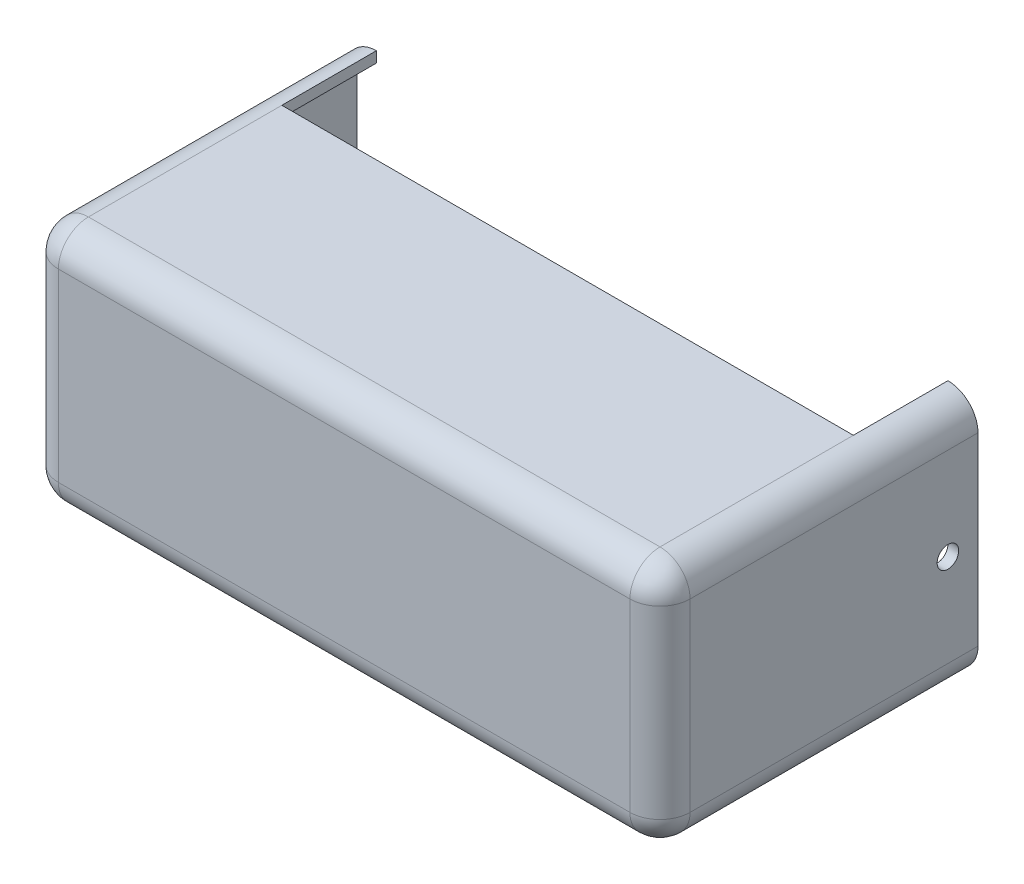
ISO-10303-21;
HEADER;
FILE_DESCRIPTION(('STEP AP214'),'2;1');
FILE_NAME('part.step','',(''),(''),'','','');
FILE_SCHEMA(('AUTOMOTIVE_DESIGN { 1 0 10303 214 1 1 1 1 }'));
ENDSEC;
DATA;
#1=APPLICATION_CONTEXT('core data for automotive mechanical design processes');
#2=APPLICATION_PROTOCOL_DEFINITION('international standard','automotive_design',2000,#1);
#3=PRODUCT_CONTEXT('',#1,'mechanical');
#4=PRODUCT('Part','Part','',(#3));
#5=PRODUCT_RELATED_PRODUCT_CATEGORY('part','',(#4));
#6=PRODUCT_DEFINITION_FORMATION('','',#4);
#7=PRODUCT_DEFINITION_CONTEXT('part definition',#1,'design');
#8=PRODUCT_DEFINITION('design','',#6,#7);
#9=PRODUCT_DEFINITION_SHAPE('','',#8);
#10=(LENGTH_UNIT() NAMED_UNIT(*) SI_UNIT(.MILLI.,.METRE.));
#11=(NAMED_UNIT(*) PLANE_ANGLE_UNIT() SI_UNIT($,.RADIAN.));
#12=(NAMED_UNIT(*) SI_UNIT($,.STERADIAN.) SOLID_ANGLE_UNIT());
#13=UNCERTAINTY_MEASURE_WITH_UNIT(LENGTH_MEASURE(1.E-05),#10,'distance_accuracy_value','');
#14=(GEOMETRIC_REPRESENTATION_CONTEXT(3) GLOBAL_UNCERTAINTY_ASSIGNED_CONTEXT((#13)) GLOBAL_UNIT_ASSIGNED_CONTEXT((#10,
#11,#12)) REPRESENTATION_CONTEXT('',''));
#15=CARTESIAN_POINT('',(0.,0.,0.));
#16=DIRECTION('',(0.,0.,1.));
#17=DIRECTION('',(1.,0.,0.));
#18=AXIS2_PLACEMENT_3D('',#15,#16,#17);
#19=CARTESIAN_POINT('',(373.38,0.,-132.08));
#20=DIRECTION('',(0.,0.,1.));
#21=DIRECTION('',(1.,0.,0.));
#22=AXIS2_PLACEMENT_3D('',#19,#20,#21);
#23=PLANE('',#22);
#24=DIRECTION('',(-1.,0.,0.));
#25=VECTOR('',#24,1.);
#26=CARTESIAN_POINT('',(373.38,138.43,-132.08));
#27=LINE('',#26,#25);
#28=CARTESIAN_POINT('',(355.6,138.43,-132.08));
#29=VERTEX_POINT('',#28);
#30=CARTESIAN_POINT('',(17.7800000000002,138.43,-132.08));
#31=VERTEX_POINT('',#30);
#32=EDGE_CURVE('E352',#29,#31,#27,.T.);
#33=ORIENTED_EDGE('',*,*,#32,.T.);
#34=DIRECTION('',(0.,1.,0.));
#35=VECTOR('',#34,1.);
#36=CARTESIAN_POINT('',(17.7800000000001,0.,-132.08));
#37=LINE('',#36,#35);
#38=CARTESIAN_POINT('',(17.7800000000002,144.78,-132.08));
#39=VERTEX_POINT('',#38);
#40=EDGE_CURVE('E215',#31,#39,#37,.T.);
#41=ORIENTED_EDGE('',*,*,#40,.T.);
#42=DIRECTION('',(-1.,0.,0.));
#43=VECTOR('',#42,1.);
#44=CARTESIAN_POINT('',(373.38,144.78,-132.08));
#45=LINE('',#44,#43);
#46=CARTESIAN_POINT('',(355.6,144.78,-132.08));
#47=VERTEX_POINT('',#46);
#48=EDGE_CURVE('E431',#47,#39,#45,.T.);
#49=ORIENTED_EDGE('',*,*,#48,.F.);
#50=DIRECTION('',(0.,-1.,0.));
#51=VECTOR('',#50,1.);
#52=CARTESIAN_POINT('',(355.6,0.,-132.08));
#53=LINE('',#52,#51);
#54=EDGE_CURVE('E219',#47,#29,#53,.T.);
#55=ORIENTED_EDGE('',*,*,#54,.T.);
#56=EDGE_LOOP('',(#33,#41,#49,#55));
#57=FACE_BOUND('',#56,.T.);
#58=ADVANCED_FACE('F44',(#57),#23,.F.);
#59=CARTESIAN_POINT('',(373.38,0.,0.));
#60=DIRECTION('',(0.,0.,-1.));
#61=DIRECTION('',(-1.,0.,0.));
#62=AXIS2_PLACEMENT_3D('',#59,#60,#61);
#63=PLANE('',#62);
#64=DIRECTION('',(-1.,0.,0.));
#65=VECTOR('',#64,1.);
#66=CARTESIAN_POINT('',(373.38,17.78,0.));
#67=LINE('',#66,#65);
#68=CARTESIAN_POINT('',(17.78,17.78,0.));
#69=VERTEX_POINT('',#68);
#70=CARTESIAN_POINT('',(355.6,17.78,0.));
#71=VERTEX_POINT('',#70);
#72=EDGE_CURVE('E54',#69,#71,#67,.F.);
#73=ORIENTED_EDGE('',*,*,#72,.T.);
#74=DIRECTION('',(0.,-1.,0.));
#75=VECTOR('',#74,1.);
#76=CARTESIAN_POINT('',(355.6,0.,0.));
#77=LINE('',#76,#75);
#78=CARTESIAN_POINT('',(355.6,127.,0.));
#79=VERTEX_POINT('',#78);
#80=EDGE_CURVE('E11',#71,#79,#77,.F.);
#81=ORIENTED_EDGE('',*,*,#80,.T.);
#82=DIRECTION('',(-1.,0.,0.));
#83=VECTOR('',#82,1.);
#84=CARTESIAN_POINT('',(373.38,127.,0.));
#85=LINE('',#84,#83);
#86=CARTESIAN_POINT('',(17.78,127.,0.));
#87=VERTEX_POINT('',#86);
#88=EDGE_CURVE('E481',#79,#87,#85,.T.);
#89=ORIENTED_EDGE('',*,*,#88,.T.);
#90=DIRECTION('',(0.,-1.,0.));
#91=VECTOR('',#90,1.);
#92=CARTESIAN_POINT('',(17.78,0.,0.));
#93=LINE('',#92,#91);
#94=EDGE_CURVE('E478',#87,#69,#93,.T.);
#95=ORIENTED_EDGE('',*,*,#94,.T.);
#96=EDGE_LOOP('',(#73,#81,#89,#95));
#97=FACE_BOUND('',#96,.T.);
#98=ADVANCED_FACE('F542',(#97),#63,.F.);
#99=CARTESIAN_POINT('',(373.38,0.,0.));
#100=DIRECTION('',(0.,1.,0.));
#101=DIRECTION('',(0.,0.,1.));
#102=AXIS2_PLACEMENT_3D('',#99,#100,#101);
#103=PLANE('',#102);
#104=DIRECTION('',(-1.,0.,0.));
#105=VECTOR('',#104,1.);
#106=CARTESIAN_POINT('',(373.38,0.,-17.78));
#107=LINE('',#106,#105);
#108=CARTESIAN_POINT('',(355.6,0.,-17.78));
#109=VERTEX_POINT('',#108);
#110=CARTESIAN_POINT('',(17.78,0.,-17.78));
#111=VERTEX_POINT('',#110);
#112=EDGE_CURVE('E440',#109,#111,#107,.T.);
#113=ORIENTED_EDGE('',*,*,#112,.T.);
#114=DIRECTION('',(0.,0.,-1.));
#115=VECTOR('',#114,1.);
#116=CARTESIAN_POINT('',(17.78,0.,-132.08));
#117=LINE('',#116,#115);
#118=CARTESIAN_POINT('',(17.7800000000001,0.,-132.08));
#119=VERTEX_POINT('',#118);
#120=EDGE_CURVE('E446',#111,#119,#117,.T.);
#121=ORIENTED_EDGE('',*,*,#120,.T.);
#122=DIRECTION('',(-1.,0.,0.));
#123=VECTOR('',#122,1.);
#124=CARTESIAN_POINT('',(373.38,0.,-132.08));
#125=LINE('',#124,#123);
#126=CARTESIAN_POINT('',(355.6,0.,-132.08));
#127=VERTEX_POINT('',#126);
#128=EDGE_CURVE('E435',#127,#119,#125,.T.);
#129=ORIENTED_EDGE('',*,*,#128,.F.);
#130=DIRECTION('',(0.,0.,-1.));
#131=VECTOR('',#130,1.);
#132=CARTESIAN_POINT('',(355.6,0.,0.));
#133=LINE('',#132,#131);
#134=EDGE_CURVE('E443',#127,#109,#133,.F.);
#135=ORIENTED_EDGE('',*,*,#134,.T.);
#136=EDGE_LOOP('',(#113,#121,#129,#135));
#137=FACE_BOUND('',#136,.T.);
#138=ADVANCED_FACE('F560',(#137),#103,.F.);
#139=DIRECTION('',(0.,-1.,0.));
#140=VECTOR('',#139,1.);
#141=CARTESIAN_POINT('',(17.7800000000001,1.16573417585642E-13,-132.08));
#142=LINE('',#141,#140);
#143=CARTESIAN_POINT('',(17.7800000000001,6.35,-132.08));
#144=VERTEX_POINT('',#143);
#145=EDGE_CURVE('E240',#144,#119,#142,.T.);
#146=ORIENTED_EDGE('',*,*,#145,.F.);
#147=DIRECTION('',(-1.,0.,0.));
#148=VECTOR('',#147,1.);
#149=CARTESIAN_POINT('',(373.38,6.35,-132.08));
#150=LINE('',#149,#148);
#151=CARTESIAN_POINT('',(355.6,6.35,-132.08));
#152=VERTEX_POINT('',#151);
#153=EDGE_CURVE('E413',#152,#144,#150,.T.);
#154=ORIENTED_EDGE('',*,*,#153,.F.);
#155=DIRECTION('',(0.,-1.,0.));
#156=VECTOR('',#155,1.);
#157=CARTESIAN_POINT('',(355.6,0.,-132.08));
#158=LINE('',#157,#156);
#159=EDGE_CURVE('E282',#152,#127,#158,.T.);
#160=ORIENTED_EDGE('',*,*,#159,.T.);
#161=ORIENTED_EDGE('',*,*,#128,.T.);
#162=EDGE_LOOP('',(#146,#154,#160,#161));
#163=FACE_BOUND('',#162,.T.);
#164=ADVANCED_FACE('F564',(#163),#23,.F.);
#165=CARTESIAN_POINT('',(373.38,144.78,0.));
#166=DIRECTION('',(0.,-1.,0.));
#167=DIRECTION('',(0.,0.,-1.));
#168=AXIS2_PLACEMENT_3D('',#165,#166,#167);
#169=PLANE('',#168);
#170=DIRECTION('',(-1.,0.,0.));
#171=VECTOR('',#170,1.);
#172=CARTESIAN_POINT('',(373.38,144.78,-17.78));
#173=LINE('',#172,#171);
#174=CARTESIAN_POINT('',(17.78,144.78,-17.78));
#175=VERTEX_POINT('',#174);
#176=CARTESIAN_POINT('',(355.6,144.78,-17.78));
#177=VERTEX_POINT('',#176);
#178=EDGE_CURVE('E468',#175,#177,#173,.F.);
#179=ORIENTED_EDGE('',*,*,#178,.T.);
#180=DIRECTION('',(0.,0.,1.));
#181=VECTOR('',#180,1.);
#182=CARTESIAN_POINT('',(355.6,144.78,0.));
#183=LINE('',#182,#181);
#184=EDGE_CURVE('E474',#177,#47,#183,.F.);
#185=ORIENTED_EDGE('',*,*,#184,.T.);
#186=ORIENTED_EDGE('',*,*,#48,.T.);
#187=DIRECTION('',(0.,0.,1.));
#188=VECTOR('',#187,1.);
#189=CARTESIAN_POINT('',(17.78,144.78,0.));
#190=LINE('',#189,#188);
#191=EDGE_CURVE('E471',#39,#175,#190,.T.);
#192=ORIENTED_EDGE('',*,*,#191,.T.);
#193=EDGE_LOOP('',(#179,#185,#186,#192));
#194=FACE_BOUND('',#193,.T.);
#195=ADVANCED_FACE('F645',(#194),#169,.F.);
#196=CARTESIAN_POINT('',(373.38,0.,0.));
#197=DIRECTION('',(-1.,0.,0.));
#198=DIRECTION('',(0.,0.,1.));
#199=AXIS2_PLACEMENT_3D('',#196,#197,#198);
#200=PLANE('',#199);
#201=CARTESIAN_POINT('',(373.38,72.39,-170.18));
#202=DIRECTION('',(1.,0.,0.));
#203=DIRECTION('',(0.,0.,-1.));
#204=AXIS2_PLACEMENT_3D('',#201,#202,#203);
#205=CIRCLE('',#204,6.34999999999999);
#206=CARTESIAN_POINT('',(373.38,72.39,-176.53));
#207=VERTEX_POINT('',#206);
#208=EDGE_CURVE('E1152',#207,#207,#205,.T.);
#209=ORIENTED_EDGE('',*,*,#208,.F.);
#210=EDGE_LOOP('',(#209));
#211=FACE_BOUND('',#210,.T.);
#212=DIRECTION('',(0.,-1.,0.));
#213=VECTOR('',#212,1.);
#214=CARTESIAN_POINT('',(373.38,0.,-17.78));
#215=LINE('',#214,#213);
#216=CARTESIAN_POINT('',(373.38,127.,-17.78));
#217=VERTEX_POINT('',#216);
#218=CARTESIAN_POINT('',(373.38,17.78,-17.78));
#219=VERTEX_POINT('',#218);
#220=EDGE_CURVE('E459',#217,#219,#215,.T.);
#221=ORIENTED_EDGE('',*,*,#220,.T.);
#222=DIRECTION('',(0.,0.,-1.));
#223=VECTOR('',#222,1.);
#224=CARTESIAN_POINT('',(373.38,17.78,0.));
#225=LINE('',#224,#223);
#226=CARTESIAN_POINT('',(373.38,17.78,-187.96));
#227=VERTEX_POINT('',#226);
#228=EDGE_CURVE('E465',#219,#227,#225,.T.);
#229=ORIENTED_EDGE('',*,*,#228,.T.);
#230=DIRECTION('',(0.,-1.,0.));
#231=VECTOR('',#230,1.);
#232=CARTESIAN_POINT('',(373.38,0.,-187.96));
#233=LINE('',#232,#231);
#234=CARTESIAN_POINT('',(373.38,127.,-187.96));
#235=VERTEX_POINT('',#234);
#236=EDGE_CURVE('E286',#235,#227,#233,.T.);
#237=ORIENTED_EDGE('',*,*,#236,.F.);
#238=DIRECTION('',(0.,0.,1.));
#239=VECTOR('',#238,1.);
#240=CARTESIAN_POINT('',(373.38,127.,0.));
#241=LINE('',#240,#239);
#242=EDGE_CURVE('E462',#235,#217,#241,.T.);
#243=ORIENTED_EDGE('',*,*,#242,.T.);
#244=EDGE_LOOP('',(#221,#229,#237,#243));
#245=FACE_BOUND('',#244,.T.);
#246=ADVANCED_FACE('F637',(#211,#245),#200,.F.);
#247=CARTESIAN_POINT('',(0.,0.,0.));
#248=DIRECTION('',(-1.,0.,0.));
#249=DIRECTION('',(0.,0.,1.));
#250=AXIS2_PLACEMENT_3D('',#247,#248,#249);
#251=PLANE('',#250);
#252=CARTESIAN_POINT('',(0.,72.39,-170.18));
#253=DIRECTION('',(-1.,0.,0.));
#254=DIRECTION('',(0.,0.,1.));
#255=AXIS2_PLACEMENT_3D('',#252,#253,#254);
#256=CIRCLE('',#255,6.34999999999999);
#257=CARTESIAN_POINT('',(0.,72.39,-163.83));
#258=VERTEX_POINT('',#257);
#259=EDGE_CURVE('E246',#258,#258,#256,.T.);
#260=ORIENTED_EDGE('',*,*,#259,.F.);
#261=EDGE_LOOP('',(#260));
#262=FACE_BOUND('',#261,.T.);
#263=DIRECTION('',(0.,0.,1.));
#264=VECTOR('',#263,1.);
#265=CARTESIAN_POINT('',(0.,127.,-132.08));
#266=LINE('',#265,#264);
#267=CARTESIAN_POINT('',(0.,127.,-17.78));
#268=VERTEX_POINT('',#267);
#269=CARTESIAN_POINT('',(0.,127.,-187.96));
#270=VERTEX_POINT('',#269);
#271=EDGE_CURVE('E453',#268,#270,#266,.F.);
#272=ORIENTED_EDGE('',*,*,#271,.T.);
#273=DIRECTION('',(0.,1.,0.));
#274=VECTOR('',#273,1.);
#275=CARTESIAN_POINT('',(0.,0.,-187.96));
#276=LINE('',#275,#274);
#277=CARTESIAN_POINT('',(0.,17.78,-187.96));
#278=VERTEX_POINT('',#277);
#279=EDGE_CURVE('E261',#278,#270,#276,.T.);
#280=ORIENTED_EDGE('',*,*,#279,.F.);
#281=DIRECTION('',(0.,0.,-1.));
#282=VECTOR('',#281,1.);
#283=CARTESIAN_POINT('',(0.,17.78,0.));
#284=LINE('',#283,#282);
#285=CARTESIAN_POINT('',(0.,17.78,-17.78));
#286=VERTEX_POINT('',#285);
#287=EDGE_CURVE('E456',#278,#286,#284,.F.);
#288=ORIENTED_EDGE('',*,*,#287,.T.);
#289=DIRECTION('',(0.,-1.,0.));
#290=VECTOR('',#289,1.);
#291=CARTESIAN_POINT('',(0.,144.78,-17.78));
#292=LINE('',#291,#290);
#293=EDGE_CURVE('E450',#286,#268,#292,.F.);
#294=ORIENTED_EDGE('',*,*,#293,.T.);
#295=EDGE_LOOP('',(#272,#280,#288,#294));
#296=FACE_BOUND('',#295,.T.);
#297=ADVANCED_FACE('F706',(#262,#296),#251,.T.);
#298=CARTESIAN_POINT('',(355.6,127.,0.));
#299=DIRECTION('',(0.,0.,1.));
#300=DIRECTION('',(1.,0.,0.));
#301=AXIS2_PLACEMENT_3D('',#298,#299,#300);
#302=CYLINDRICAL_SURFACE('',#301,17.78);
#303=CARTESIAN_POINT('',(355.6,127.,-17.78));
#304=DIRECTION('',(0.,0.,1.));
#305=DIRECTION('',(1.,0.,0.));
#306=AXIS2_PLACEMENT_3D('',#303,#304,#305);
#307=CIRCLE('',#306,17.78);
#308=EDGE_CURVE('E436',#217,#177,#307,.T.);
#309=ORIENTED_EDGE('',*,*,#308,.F.);
#310=ORIENTED_EDGE('',*,*,#242,.F.);
#311=CARTESIAN_POINT('',(355.6,127.,-187.96));
#312=DIRECTION('',(0.,0.,-1.));
#313=DIRECTION('',(-1.,0.,0.));
#314=AXIS2_PLACEMENT_3D('',#311,#312,#313);
#315=CIRCLE('',#314,17.78);
#316=CARTESIAN_POINT('',(355.6,144.78,-187.96));
#317=VERTEX_POINT('',#316);
#318=EDGE_CURVE('E281',#317,#235,#315,.T.);
#319=ORIENTED_EDGE('',*,*,#318,.F.);
#320=DIRECTION('',(0.,0.,1.));
#321=VECTOR('',#320,1.);
#322=CARTESIAN_POINT('',(355.6,144.78,-187.96));
#323=LINE('',#322,#321);
#324=EDGE_CURVE('E323',#317,#47,#323,.T.);
#325=ORIENTED_EDGE('',*,*,#324,.T.);
#326=ORIENTED_EDGE('',*,*,#184,.F.);
#327=EDGE_LOOP('',(#309,#310,#319,#325,#326));
#328=FACE_BOUND('',#327,.T.);
#329=ADVANCED_FACE('F46',(#328),#302,.T.);
#330=CARTESIAN_POINT('',(355.6,127.,-17.78));
#331=DIRECTION('',(0.,1.,0.));
#332=DIRECTION('',(0.,0.,1.));
#333=AXIS2_PLACEMENT_3D('',#330,#331,#332);
#334=SPHERICAL_SURFACE('',#333,17.78);
#335=CARTESIAN_POINT('',(355.6,127.,-17.78));
#336=DIRECTION('',(0.,1.,0.));
#337=DIRECTION('',(-1.,0.,0.));
#338=AXIS2_PLACEMENT_3D('',#335,#336,#337);
#339=CIRCLE('',#338,17.78);
#340=EDGE_CURVE('E518',#217,#79,#339,.F.);
#341=ORIENTED_EDGE('',*,*,#340,.F.);
#342=ORIENTED_EDGE('',*,*,#308,.T.);
#343=CARTESIAN_POINT('',(355.6,127.,-17.78));
#344=DIRECTION('',(1.,0.,0.));
#345=DIRECTION('',(0.,0.,-1.));
#346=AXIS2_PLACEMENT_3D('',#343,#344,#345);
#347=CIRCLE('',#346,17.78);
#348=EDGE_CURVE('E521',#79,#177,#347,.F.);
#349=ORIENTED_EDGE('',*,*,#348,.F.);
#350=EDGE_LOOP('',(#341,#342,#349));
#351=FACE_BOUND('',#350,.T.);
#352=ADVANCED_FACE('F531',(#351),#334,.T.);
#353=CARTESIAN_POINT('',(17.78,127.,0.));
#354=DIRECTION('',(0.,0.,-1.));
#355=DIRECTION('',(-1.,0.,0.));
#356=AXIS2_PLACEMENT_3D('',#353,#354,#355);
#357=CYLINDRICAL_SURFACE('',#356,17.78);
#358=ORIENTED_EDGE('',*,*,#191,.F.);
#359=DIRECTION('',(0.,0.,1.));
#360=VECTOR('',#359,1.);
#361=CARTESIAN_POINT('',(17.7800000000002,144.78,-187.96));
#362=LINE('',#361,#360);
#363=CARTESIAN_POINT('',(17.7800000000002,144.78,-187.96));
#364=VERTEX_POINT('',#363);
#365=EDGE_CURVE('E266',#364,#39,#362,.T.);
#366=ORIENTED_EDGE('',*,*,#365,.F.);
#367=CARTESIAN_POINT('',(17.78,127.,-187.96));
#368=DIRECTION('',(0.,0.,-1.));
#369=DIRECTION('',(-1.,0.,0.));
#370=AXIS2_PLACEMENT_3D('',#367,#368,#369);
#371=CIRCLE('',#370,17.78);
#372=EDGE_CURVE('E237',#270,#364,#371,.T.);
#373=ORIENTED_EDGE('',*,*,#372,.F.);
#374=ORIENTED_EDGE('',*,*,#271,.F.);
#375=CARTESIAN_POINT('',(17.78,127.,-17.78));
#376=DIRECTION('',(0.,0.,1.));
#377=DIRECTION('',(1.,0.,0.));
#378=AXIS2_PLACEMENT_3D('',#375,#376,#377);
#379=CIRCLE('',#378,17.78);
#380=EDGE_CURVE('E514',#175,#268,#379,.T.);
#381=ORIENTED_EDGE('',*,*,#380,.F.);
#382=EDGE_LOOP('',(#358,#366,#373,#374,#381));
#383=FACE_BOUND('',#382,.T.);
#384=ADVANCED_FACE('F699',(#383),#357,.T.);
#385=CARTESIAN_POINT('',(373.38,127.,-17.78));
#386=DIRECTION('',(-1.,0.,0.));
#387=DIRECTION('',(0.,0.,1.));
#388=AXIS2_PLACEMENT_3D('',#385,#386,#387);
#389=CYLINDRICAL_SURFACE('',#388,17.78);
#390=ORIENTED_EDGE('',*,*,#348,.T.);
#391=ORIENTED_EDGE('',*,*,#178,.F.);
#392=CARTESIAN_POINT('',(17.78,127.,-17.78));
#393=DIRECTION('',(-1.,0.,0.));
#394=DIRECTION('',(0.,0.,1.));
#395=AXIS2_PLACEMENT_3D('',#392,#393,#394);
#396=CIRCLE('',#395,17.78);
#397=EDGE_CURVE('E510',#87,#175,#396,.T.);
#398=ORIENTED_EDGE('',*,*,#397,.F.);
#399=ORIENTED_EDGE('',*,*,#88,.F.);
#400=EDGE_LOOP('',(#390,#391,#398,#399));
#401=FACE_BOUND('',#400,.T.);
#402=ADVANCED_FACE('F538',(#401),#389,.T.);
#403=CARTESIAN_POINT('',(355.6,0.,-17.78));
#404=DIRECTION('',(0.,-1.,0.));
#405=DIRECTION('',(0.,0.,-1.));
#406=AXIS2_PLACEMENT_3D('',#403,#404,#405);
#407=CYLINDRICAL_SURFACE('',#406,17.78);
#408=ORIENTED_EDGE('',*,*,#340,.T.);
#409=ORIENTED_EDGE('',*,*,#80,.F.);
#410=CARTESIAN_POINT('',(355.6,17.78,-17.78));
#411=DIRECTION('',(0.,-1.,0.));
#412=DIRECTION('',(0.,0.,-1.));
#413=AXIS2_PLACEMENT_3D('',#410,#411,#412);
#414=CIRCLE('',#413,17.78);
#415=EDGE_CURVE('E507',#219,#71,#414,.T.);
#416=ORIENTED_EDGE('',*,*,#415,.F.);
#417=ORIENTED_EDGE('',*,*,#220,.F.);
#418=EDGE_LOOP('',(#408,#409,#416,#417));
#419=FACE_BOUND('',#418,.T.);
#420=ADVANCED_FACE('F635',(#419),#407,.T.);
#421=CARTESIAN_POINT('',(355.6,17.78,0.));
#422=DIRECTION('',(0.,0.,-1.));
#423=DIRECTION('',(-1.,0.,0.));
#424=AXIS2_PLACEMENT_3D('',#421,#422,#423);
#425=CYLINDRICAL_SURFACE('',#424,17.78);
#426=ORIENTED_EDGE('',*,*,#134,.F.);
#427=DIRECTION('',(0.,0.,1.));
#428=VECTOR('',#427,1.);
#429=CARTESIAN_POINT('',(355.6,0.,-187.96));
#430=LINE('',#429,#428);
#431=CARTESIAN_POINT('',(355.6,0.,-187.96));
#432=VERTEX_POINT('',#431);
#433=EDGE_CURVE('E320',#432,#127,#430,.T.);
#434=ORIENTED_EDGE('',*,*,#433,.F.);
#435=CARTESIAN_POINT('',(355.6,17.78,-187.96));
#436=DIRECTION('',(0.,0.,-1.));
#437=DIRECTION('',(-1.,0.,0.));
#438=AXIS2_PLACEMENT_3D('',#435,#436,#437);
#439=CIRCLE('',#438,17.78);
#440=EDGE_CURVE('E290',#227,#432,#439,.T.);
#441=ORIENTED_EDGE('',*,*,#440,.F.);
#442=ORIENTED_EDGE('',*,*,#228,.F.);
#443=CARTESIAN_POINT('',(355.6,17.78,-17.78));
#444=DIRECTION('',(0.,0.,1.));
#445=DIRECTION('',(1.,0.,0.));
#446=AXIS2_PLACEMENT_3D('',#443,#444,#445);
#447=CIRCLE('',#446,17.78);
#448=EDGE_CURVE('E503',#109,#219,#447,.T.);
#449=ORIENTED_EDGE('',*,*,#448,.F.);
#450=EDGE_LOOP('',(#426,#434,#441,#442,#449));
#451=FACE_BOUND('',#450,.T.);
#452=ADVANCED_FACE('F629',(#451),#425,.T.);
#453=CARTESIAN_POINT('',(17.78,127.,-17.78));
#454=DIRECTION('',(0.,1.,0.));
#455=DIRECTION('',(-1.,0.,0.));
#456=AXIS2_PLACEMENT_3D('',#453,#454,#455);
#457=SPHERICAL_SURFACE('',#456,17.78);
#458=ORIENTED_EDGE('',*,*,#397,.T.);
#459=ORIENTED_EDGE('',*,*,#380,.T.);
#460=CARTESIAN_POINT('',(17.78,127.,-17.78));
#461=DIRECTION('',(0.,1.,0.));
#462=DIRECTION('',(0.,0.,1.));
#463=AXIS2_PLACEMENT_3D('',#460,#461,#462);
#464=CIRCLE('',#463,17.78);
#465=EDGE_CURVE('E499',#87,#268,#464,.F.);
#466=ORIENTED_EDGE('',*,*,#465,.F.);
#467=EDGE_LOOP('',(#458,#459,#466));
#468=FACE_BOUND('',#467,.T.);
#469=ADVANCED_FACE('F689',(#468),#457,.T.);
#470=CARTESIAN_POINT('',(355.6,17.78,-17.78));
#471=DIRECTION('',(1.,0.,0.));
#472=DIRECTION('',(0.,0.,-1.));
#473=AXIS2_PLACEMENT_3D('',#470,#471,#472);
#474=SPHERICAL_SURFACE('',#473,17.78);
#475=ORIENTED_EDGE('',*,*,#448,.T.);
#476=ORIENTED_EDGE('',*,*,#415,.T.);
#477=CARTESIAN_POINT('',(355.6,17.78,-17.78));
#478=DIRECTION('',(1.,0.,0.));
#479=DIRECTION('',(0.,0.,-1.));
#480=AXIS2_PLACEMENT_3D('',#477,#478,#479);
#481=CIRCLE('',#480,17.78);
#482=EDGE_CURVE('E62',#109,#71,#481,.F.);
#483=ORIENTED_EDGE('',*,*,#482,.F.);
#484=EDGE_LOOP('',(#475,#476,#483));
#485=FACE_BOUND('',#484,.T.);
#486=ADVANCED_FACE('F633',(#485),#474,.T.);
#487=CARTESIAN_POINT('',(17.78,0.,-17.78));
#488=DIRECTION('',(0.,1.,0.));
#489=DIRECTION('',(0.,0.,1.));
#490=AXIS2_PLACEMENT_3D('',#487,#488,#489);
#491=CYLINDRICAL_SURFACE('',#490,17.78);
#492=ORIENTED_EDGE('',*,*,#465,.T.);
#493=ORIENTED_EDGE('',*,*,#293,.F.);
#494=CARTESIAN_POINT('',(17.78,17.78,-17.78));
#495=DIRECTION('',(0.,-1.,0.));
#496=DIRECTION('',(0.,0.,-1.));
#497=AXIS2_PLACEMENT_3D('',#494,#495,#496);
#498=CIRCLE('',#497,17.78);
#499=EDGE_CURVE('E493',#69,#286,#498,.T.);
#500=ORIENTED_EDGE('',*,*,#499,.F.);
#501=ORIENTED_EDGE('',*,*,#94,.F.);
#502=EDGE_LOOP('',(#492,#493,#500,#501));
#503=FACE_BOUND('',#502,.T.);
#504=ADVANCED_FACE('F550',(#503),#491,.T.);
#505=CARTESIAN_POINT('',(373.38,17.78,-17.78));
#506=DIRECTION('',(-1.,0.,0.));
#507=DIRECTION('',(0.,0.,1.));
#508=AXIS2_PLACEMENT_3D('',#505,#506,#507);
#509=CYLINDRICAL_SURFACE('',#508,17.78);
#510=ORIENTED_EDGE('',*,*,#482,.T.);
#511=ORIENTED_EDGE('',*,*,#72,.F.);
#512=CARTESIAN_POINT('',(17.78,17.78,-17.78));
#513=DIRECTION('',(-1.,0.,0.));
#514=DIRECTION('',(0.,0.,1.));
#515=AXIS2_PLACEMENT_3D('',#512,#513,#514);
#516=CIRCLE('',#515,17.78);
#517=EDGE_CURVE('E489',#111,#69,#516,.T.);
#518=ORIENTED_EDGE('',*,*,#517,.F.);
#519=ORIENTED_EDGE('',*,*,#112,.F.);
#520=EDGE_LOOP('',(#510,#511,#518,#519));
#521=FACE_BOUND('',#520,.T.);
#522=ADVANCED_FACE('F547',(#521),#509,.T.);
#523=CARTESIAN_POINT('',(17.78,17.78,-17.78));
#524=DIRECTION('',(0.,0.,1.));
#525=DIRECTION('',(1.,0.,0.));
#526=AXIS2_PLACEMENT_3D('',#523,#524,#525);
#527=SPHERICAL_SURFACE('',#526,17.78);
#528=ORIENTED_EDGE('',*,*,#517,.T.);
#529=ORIENTED_EDGE('',*,*,#499,.T.);
#530=CARTESIAN_POINT('',(17.78,17.78,-17.78));
#531=DIRECTION('',(0.,0.,1.));
#532=DIRECTION('',(0.,-1.,0.));
#533=AXIS2_PLACEMENT_3D('',#530,#531,#532);
#534=CIRCLE('',#533,17.78);
#535=EDGE_CURVE('E335',#111,#286,#534,.F.);
#536=ORIENTED_EDGE('',*,*,#535,.F.);
#537=EDGE_LOOP('',(#528,#529,#536));
#538=FACE_BOUND('',#537,.T.);
#539=ADVANCED_FACE('F552',(#538),#527,.T.);
#540=CARTESIAN_POINT('',(17.78,17.78,0.));
#541=DIRECTION('',(0.,0.,1.));
#542=DIRECTION('',(1.,0.,0.));
#543=AXIS2_PLACEMENT_3D('',#540,#541,#542);
#544=CYLINDRICAL_SURFACE('',#543,17.78);
#545=ORIENTED_EDGE('',*,*,#535,.T.);
#546=ORIENTED_EDGE('',*,*,#287,.F.);
#547=CARTESIAN_POINT('',(17.78,17.78,-187.96));
#548=DIRECTION('',(0.,0.,-1.));
#549=DIRECTION('',(-1.,0.,0.));
#550=AXIS2_PLACEMENT_3D('',#547,#548,#549);
#551=CIRCLE('',#550,17.78);
#552=CARTESIAN_POINT('',(17.7800000000001,0.,-187.96));
#553=VERTEX_POINT('',#552);
#554=EDGE_CURVE('E257',#553,#278,#551,.T.);
#555=ORIENTED_EDGE('',*,*,#554,.F.);
#556=DIRECTION('',(0.,0.,1.));
#557=VECTOR('',#556,1.);
#558=CARTESIAN_POINT('',(17.7800000000001,0.,-187.96));
#559=LINE('',#558,#557);
#560=EDGE_CURVE('E271',#553,#119,#559,.T.);
#561=ORIENTED_EDGE('',*,*,#560,.T.);
#562=ORIENTED_EDGE('',*,*,#120,.F.);
#563=EDGE_LOOP('',(#545,#546,#555,#561,#562));
#564=FACE_BOUND('',#563,.T.);
#565=ADVANCED_FACE('F555',(#564),#544,.T.);
#566=CARTESIAN_POINT('',(373.38,0.,-6.35));
#567=DIRECTION('',(0.,0.,-1.));
#568=DIRECTION('',(-1.,0.,0.));
#569=AXIS2_PLACEMENT_3D('',#566,#567,#568);
#570=PLANE('',#569);
#571=DIRECTION('',(-1.,0.,0.));
#572=VECTOR('',#571,1.);
#573=CARTESIAN_POINT('',(373.38,17.78,-6.35));
#574=LINE('',#573,#572);
#575=CARTESIAN_POINT('',(17.78,17.78,-6.35));
#576=VERTEX_POINT('',#575);
#577=CARTESIAN_POINT('',(355.6,17.78,-6.34999999999999));
#578=VERTEX_POINT('',#577);
#579=EDGE_CURVE('E327',#576,#578,#574,.F.);
#580=ORIENTED_EDGE('',*,*,#579,.F.);
#581=DIRECTION('',(0.,1.,0.));
#582=VECTOR('',#581,1.);
#583=CARTESIAN_POINT('',(17.78,0.,-6.35));
#584=LINE('',#583,#582);
#585=CARTESIAN_POINT('',(17.78,127.,-6.35));
#586=VERTEX_POINT('',#585);
#587=EDGE_CURVE('E338',#586,#576,#584,.F.);
#588=ORIENTED_EDGE('',*,*,#587,.F.);
#589=DIRECTION('',(-1.,0.,0.));
#590=VECTOR('',#589,1.);
#591=CARTESIAN_POINT('',(373.38,127.,-6.35));
#592=LINE('',#591,#590);
#593=CARTESIAN_POINT('',(355.6,127.,-6.35));
#594=VERTEX_POINT('',#593);
#595=EDGE_CURVE('E332',#594,#586,#592,.T.);
#596=ORIENTED_EDGE('',*,*,#595,.F.);
#597=DIRECTION('',(0.,1.,0.));
#598=VECTOR('',#597,1.);
#599=CARTESIAN_POINT('',(355.6,0.,-6.35));
#600=LINE('',#599,#598);
#601=EDGE_CURVE('E331',#578,#594,#600,.T.);
#602=ORIENTED_EDGE('',*,*,#601,.F.);
#603=EDGE_LOOP('',(#580,#588,#596,#602));
#604=FACE_BOUND('',#603,.T.);
#605=ADVANCED_FACE('F591',(#604),#570,.T.);
#606=CARTESIAN_POINT('',(373.38,6.35,0.));
#607=DIRECTION('',(0.,1.,0.));
#608=DIRECTION('',(0.,0.,1.));
#609=AXIS2_PLACEMENT_3D('',#606,#607,#608);
#610=PLANE('',#609);
#611=DIRECTION('',(1.,0.,0.));
#612=VECTOR('',#611,1.);
#613=CARTESIAN_POINT('',(373.38,6.35,-17.78));
#614=LINE('',#613,#612);
#615=CARTESIAN_POINT('',(355.6,6.35,-17.78));
#616=VERTEX_POINT('',#615);
#617=CARTESIAN_POINT('',(17.7800000000001,6.35,-17.78));
#618=VERTEX_POINT('',#617);
#619=EDGE_CURVE('E409',#616,#618,#614,.F.);
#620=ORIENTED_EDGE('',*,*,#619,.F.);
#621=DIRECTION('',(0.,0.,1.));
#622=VECTOR('',#621,1.);
#623=CARTESIAN_POINT('',(355.6,6.35,0.));
#624=LINE('',#623,#622);
#625=EDGE_CURVE('E412',#152,#616,#624,.T.);
#626=ORIENTED_EDGE('',*,*,#625,.F.);
#627=ORIENTED_EDGE('',*,*,#153,.T.);
#628=DIRECTION('',(0.,0.,1.));
#629=VECTOR('',#628,1.);
#630=CARTESIAN_POINT('',(17.7800000000001,6.35,0.));
#631=LINE('',#630,#629);
#632=EDGE_CURVE('E393',#618,#144,#631,.F.);
#633=ORIENTED_EDGE('',*,*,#632,.F.);
#634=EDGE_LOOP('',(#620,#626,#627,#633));
#635=FACE_BOUND('',#634,.T.);
#636=ADVANCED_FACE('F574',(#635),#610,.T.);
#637=CARTESIAN_POINT('',(373.38,138.43,0.));
#638=DIRECTION('',(0.,-1.,0.));
#639=DIRECTION('',(0.,0.,-1.));
#640=AXIS2_PLACEMENT_3D('',#637,#638,#639);
#641=PLANE('',#640);
#642=DIRECTION('',(1.,0.,0.));
#643=VECTOR('',#642,1.);
#644=CARTESIAN_POINT('',(373.38,138.43,-17.78));
#645=LINE('',#644,#643);
#646=CARTESIAN_POINT('',(17.7800000000001,138.43,-17.78));
#647=VERTEX_POINT('',#646);
#648=CARTESIAN_POINT('',(355.6,138.43,-17.78));
#649=VERTEX_POINT('',#648);
#650=EDGE_CURVE('E356',#647,#649,#645,.T.);
#651=ORIENTED_EDGE('',*,*,#650,.F.);
#652=DIRECTION('',(0.,0.,-1.));
#653=VECTOR('',#652,1.);
#654=CARTESIAN_POINT('',(17.7800000000002,138.43,0.));
#655=LINE('',#654,#653);
#656=EDGE_CURVE('E359',#31,#647,#655,.F.);
#657=ORIENTED_EDGE('',*,*,#656,.F.);
#658=ORIENTED_EDGE('',*,*,#32,.F.);
#659=DIRECTION('',(0.,0.,-1.));
#660=VECTOR('',#659,1.);
#661=CARTESIAN_POINT('',(355.6,138.43,0.));
#662=LINE('',#661,#660);
#663=EDGE_CURVE('E341',#649,#29,#662,.T.);
#664=ORIENTED_EDGE('',*,*,#663,.F.);
#665=EDGE_LOOP('',(#651,#657,#658,#664));
#666=FACE_BOUND('',#665,.T.);
#667=ADVANCED_FACE('F650',(#666),#641,.T.);
#668=CARTESIAN_POINT('',(367.03,0.,0.));
#669=DIRECTION('',(-1.,0.,0.));
#670=DIRECTION('',(0.,0.,1.));
#671=AXIS2_PLACEMENT_3D('',#668,#669,#670);
#672=PLANE('',#671);
#673=CARTESIAN_POINT('',(367.03,72.39,-170.18));
#674=DIRECTION('',(-1.,0.,0.));
#675=DIRECTION('',(0.,0.,1.));
#676=AXIS2_PLACEMENT_3D('',#673,#674,#675);
#677=CIRCLE('',#676,6.34999999999999);
#678=CARTESIAN_POINT('',(367.03,72.39,-163.83));
#679=VERTEX_POINT('',#678);
#680=EDGE_CURVE('E1145',#679,#679,#677,.T.);
#681=ORIENTED_EDGE('',*,*,#680,.F.);
#682=EDGE_LOOP('',(#681));
#683=FACE_BOUND('',#682,.T.);
#684=DIRECTION('',(0.,1.,0.));
#685=VECTOR('',#684,1.);
#686=CARTESIAN_POINT('',(367.03,0.,-17.78));
#687=LINE('',#686,#685);
#688=CARTESIAN_POINT('',(367.03,127.,-17.78));
#689=VERTEX_POINT('',#688);
#690=CARTESIAN_POINT('',(367.03,17.78,-17.78));
#691=VERTEX_POINT('',#690);
#692=EDGE_CURVE('E369',#689,#691,#687,.F.);
#693=ORIENTED_EDGE('',*,*,#692,.F.);
#694=DIRECTION('',(0.,0.,1.));
#695=VECTOR('',#694,1.);
#696=CARTESIAN_POINT('',(367.03,127.,0.));
#697=LINE('',#696,#695);
#698=CARTESIAN_POINT('',(367.03,127.,-187.96));
#699=VERTEX_POINT('',#698);
#700=EDGE_CURVE('E366',#699,#689,#697,.T.);
#701=ORIENTED_EDGE('',*,*,#700,.F.);
#702=DIRECTION('',(0.,1.,0.));
#703=VECTOR('',#702,1.);
#704=CARTESIAN_POINT('',(367.03,0.,-187.96));
#705=LINE('',#704,#703);
#706=CARTESIAN_POINT('',(367.03,17.78,-187.96));
#707=VERTEX_POINT('',#706);
#708=EDGE_CURVE('E301',#707,#699,#705,.T.);
#709=ORIENTED_EDGE('',*,*,#708,.F.);
#710=DIRECTION('',(0.,0.,1.));
#711=VECTOR('',#710,1.);
#712=CARTESIAN_POINT('',(367.03,17.78,0.));
#713=LINE('',#712,#711);
#714=EDGE_CURVE('E360',#691,#707,#713,.F.);
#715=ORIENTED_EDGE('',*,*,#714,.F.);
#716=EDGE_LOOP('',(#693,#701,#709,#715));
#717=FACE_BOUND('',#716,.T.);
#718=ADVANCED_FACE('F618',(#683,#717),#672,.T.);
#719=CARTESIAN_POINT('',(6.35,0.,0.));
#720=DIRECTION('',(-1.,0.,0.));
#721=DIRECTION('',(0.,0.,1.));
#722=AXIS2_PLACEMENT_3D('',#719,#720,#721);
#723=PLANE('',#722);
#724=CARTESIAN_POINT('',(6.35,72.39,-170.18));
#725=DIRECTION('',(-1.,0.,0.));
#726=DIRECTION('',(0.,0.,1.));
#727=AXIS2_PLACEMENT_3D('',#724,#725,#726);
#728=CIRCLE('',#727,6.34999999999999);
#729=CARTESIAN_POINT('',(6.35,72.39,-163.83));
#730=VERTEX_POINT('',#729);
#731=EDGE_CURVE('E48',#730,#730,#728,.T.);
#732=ORIENTED_EDGE('',*,*,#731,.T.);
#733=EDGE_LOOP('',(#732));
#734=FACE_BOUND('',#733,.T.);
#735=DIRECTION('',(0.,0.,1.));
#736=VECTOR('',#735,1.);
#737=CARTESIAN_POINT('',(6.35,17.78,0.));
#738=LINE('',#737,#736);
#739=CARTESIAN_POINT('',(6.35000000000002,17.78,-187.96));
#740=VERTEX_POINT('',#739);
#741=CARTESIAN_POINT('',(6.35,17.78,-17.78));
#742=VERTEX_POINT('',#741);
#743=EDGE_CURVE('E372',#740,#742,#738,.T.);
#744=ORIENTED_EDGE('',*,*,#743,.F.);
#745=DIRECTION('',(0.,-1.,0.));
#746=VECTOR('',#745,1.);
#747=CARTESIAN_POINT('',(6.35,0.,-187.96));
#748=LINE('',#747,#746);
#749=CARTESIAN_POINT('',(6.35,127.,-187.96));
#750=VERTEX_POINT('',#749);
#751=EDGE_CURVE('E232',#750,#740,#748,.T.);
#752=ORIENTED_EDGE('',*,*,#751,.F.);
#753=DIRECTION('',(0.,0.,1.));
#754=VECTOR('',#753,1.);
#755=CARTESIAN_POINT('',(6.35,127.,0.));
#756=LINE('',#755,#754);
#757=CARTESIAN_POINT('',(6.35,127.,-17.78));
#758=VERTEX_POINT('',#757);
#759=EDGE_CURVE('E227',#758,#750,#756,.F.);
#760=ORIENTED_EDGE('',*,*,#759,.F.);
#761=DIRECTION('',(0.,1.,0.));
#762=VECTOR('',#761,1.);
#763=CARTESIAN_POINT('',(6.35,0.,-17.78));
#764=LINE('',#763,#762);
#765=EDGE_CURVE('E386',#742,#758,#764,.T.);
#766=ORIENTED_EDGE('',*,*,#765,.F.);
#767=EDGE_LOOP('',(#744,#752,#760,#766));
#768=FACE_BOUND('',#767,.T.);
#769=ADVANCED_FACE('F654',(#734,#768),#723,.F.);
#770=CARTESIAN_POINT('',(355.6,127.,0.));
#771=DIRECTION('',(0.,0.,1.));
#772=DIRECTION('',(1.,0.,0.));
#773=AXIS2_PLACEMENT_3D('',#770,#771,#772);
#774=CYLINDRICAL_SURFACE('',#773,11.43);
#775=CARTESIAN_POINT('',(355.6,127.,-17.78));
#776=DIRECTION('',(0.,0.,1.));
#777=DIRECTION('',(1.,0.,0.));
#778=AXIS2_PLACEMENT_3D('',#775,#776,#777);
#779=CIRCLE('',#778,11.43);
#780=EDGE_CURVE('E348',#689,#649,#779,.T.);
#781=ORIENTED_EDGE('',*,*,#780,.T.);
#782=ORIENTED_EDGE('',*,*,#663,.T.);
#783=DIRECTION('',(0.,0.,1.));
#784=VECTOR('',#783,1.);
#785=CARTESIAN_POINT('',(355.6,138.43,-187.96));
#786=LINE('',#785,#784);
#787=CARTESIAN_POINT('',(355.6,138.43,-187.96));
#788=VERTEX_POINT('',#787);
#789=EDGE_CURVE('E308',#788,#29,#786,.T.);
#790=ORIENTED_EDGE('',*,*,#789,.F.);
#791=CARTESIAN_POINT('',(355.6,127.,-187.96));
#792=DIRECTION('',(0.,0.,-1.));
#793=DIRECTION('',(-1.,0.,0.));
#794=AXIS2_PLACEMENT_3D('',#791,#792,#793);
#795=CIRCLE('',#794,11.43);
#796=EDGE_CURVE('E305',#699,#788,#795,.F.);
#797=ORIENTED_EDGE('',*,*,#796,.F.);
#798=ORIENTED_EDGE('',*,*,#700,.T.);
#799=EDGE_LOOP('',(#781,#782,#790,#797,#798));
#800=FACE_BOUND('',#799,.T.);
#801=ADVANCED_FACE('F652',(#800),#774,.F.);
#802=CARTESIAN_POINT('',(355.6,127.,-17.78));
#803=DIRECTION('',(0.,1.,0.));
#804=DIRECTION('',(0.,0.,1.));
#805=AXIS2_PLACEMENT_3D('',#802,#803,#804);
#806=SPHERICAL_SURFACE('',#805,11.43);
#807=CARTESIAN_POINT('',(355.6,127.,-17.78));
#808=DIRECTION('',(0.,-1.,0.));
#809=DIRECTION('',(0.,0.,-1.));
#810=AXIS2_PLACEMENT_3D('',#807,#808,#809);
#811=CIRCLE('',#810,11.43);
#812=EDGE_CURVE('E342',#689,#594,#811,.T.);
#813=ORIENTED_EDGE('',*,*,#812,.T.);
#814=CARTESIAN_POINT('',(355.6,127.,-17.78));
#815=DIRECTION('',(-1.,0.,0.));
#816=DIRECTION('',(0.,0.,1.));
#817=AXIS2_PLACEMENT_3D('',#814,#815,#816);
#818=CIRCLE('',#817,11.43);
#819=EDGE_CURVE('E346',#594,#649,#818,.T.);
#820=ORIENTED_EDGE('',*,*,#819,.T.);
#821=ORIENTED_EDGE('',*,*,#780,.F.);
#822=EDGE_LOOP('',(#813,#820,#821));
#823=FACE_BOUND('',#822,.T.);
#824=ADVANCED_FACE('F611',(#823),#806,.F.);
#825=CARTESIAN_POINT('',(17.78,127.,0.));
#826=DIRECTION('',(0.,0.,-1.));
#827=DIRECTION('',(-1.,0.,0.));
#828=AXIS2_PLACEMENT_3D('',#825,#826,#827);
#829=CYLINDRICAL_SURFACE('',#828,11.43);
#830=ORIENTED_EDGE('',*,*,#759,.T.);
#831=CARTESIAN_POINT('',(17.78,127.,-187.96));
#832=DIRECTION('',(0.,0.,-1.));
#833=DIRECTION('',(-1.,0.,0.));
#834=AXIS2_PLACEMENT_3D('',#831,#832,#833);
#835=CIRCLE('',#834,11.43);
#836=CARTESIAN_POINT('',(17.7800000000002,138.43,-187.96));
#837=VERTEX_POINT('',#836);
#838=EDGE_CURVE('E223',#837,#750,#835,.F.);
#839=ORIENTED_EDGE('',*,*,#838,.F.);
#840=DIRECTION('',(0.,0.,1.));
#841=VECTOR('',#840,1.);
#842=CARTESIAN_POINT('',(17.7800000000002,138.43,-187.96));
#843=LINE('',#842,#841);
#844=EDGE_CURVE('E209',#837,#31,#843,.T.);
#845=ORIENTED_EDGE('',*,*,#844,.T.);
#846=ORIENTED_EDGE('',*,*,#656,.T.);
#847=CARTESIAN_POINT('',(17.78,127.,-17.78));
#848=DIRECTION('',(0.,0.,-1.));
#849=DIRECTION('',(-1.,0.,0.));
#850=AXIS2_PLACEMENT_3D('',#847,#848,#849);
#851=CIRCLE('',#850,11.43);
#852=EDGE_CURVE('E347',#647,#758,#851,.F.);
#853=ORIENTED_EDGE('',*,*,#852,.T.);
#854=EDGE_LOOP('',(#830,#839,#845,#846,#853));
#855=FACE_BOUND('',#854,.T.);
#856=ADVANCED_FACE('F224',(#855),#829,.F.);
#857=CARTESIAN_POINT('',(373.38,127.,-17.78));
#858=DIRECTION('',(-1.,0.,0.));
#859=DIRECTION('',(0.,0.,1.));
#860=AXIS2_PLACEMENT_3D('',#857,#858,#859);
#861=CYLINDRICAL_SURFACE('',#860,11.43);
#862=ORIENTED_EDGE('',*,*,#819,.F.);
#863=ORIENTED_EDGE('',*,*,#595,.T.);
#864=CARTESIAN_POINT('',(17.78,127.,-17.78));
#865=DIRECTION('',(-1.,0.,0.));
#866=DIRECTION('',(0.,-1.,0.));
#867=AXIS2_PLACEMENT_3D('',#864,#865,#866);
#868=CIRCLE('',#867,11.43);
#869=EDGE_CURVE('E379',#586,#647,#868,.T.);
#870=ORIENTED_EDGE('',*,*,#869,.T.);
#871=ORIENTED_EDGE('',*,*,#650,.T.);
#872=EDGE_LOOP('',(#862,#863,#870,#871));
#873=FACE_BOUND('',#872,.T.);
#874=ADVANCED_FACE('F606',(#873),#861,.F.);
#875=CARTESIAN_POINT('',(355.6,0.,-17.78));
#876=DIRECTION('',(0.,-1.,0.));
#877=DIRECTION('',(0.,0.,-1.));
#878=AXIS2_PLACEMENT_3D('',#875,#876,#877);
#879=CYLINDRICAL_SURFACE('',#878,11.43);
#880=ORIENTED_EDGE('',*,*,#812,.F.);
#881=ORIENTED_EDGE('',*,*,#692,.T.);
#882=CARTESIAN_POINT('',(355.6,17.78,-17.78));
#883=DIRECTION('',(0.,1.,0.));
#884=DIRECTION('',(0.,0.,1.));
#885=AXIS2_PLACEMENT_3D('',#882,#883,#884);
#886=CIRCLE('',#885,11.43);
#887=EDGE_CURVE('E375',#691,#578,#886,.F.);
#888=ORIENTED_EDGE('',*,*,#887,.T.);
#889=ORIENTED_EDGE('',*,*,#601,.T.);
#890=EDGE_LOOP('',(#880,#881,#888,#889));
#891=FACE_BOUND('',#890,.T.);
#892=ADVANCED_FACE('F615',(#891),#879,.F.);
#893=CARTESIAN_POINT('',(355.6,17.78,0.));
#894=DIRECTION('',(0.,0.,-1.));
#895=DIRECTION('',(-1.,0.,0.));
#896=AXIS2_PLACEMENT_3D('',#893,#894,#895);
#897=CYLINDRICAL_SURFACE('',#896,11.43);
#898=ORIENTED_EDGE('',*,*,#714,.T.);
#899=CARTESIAN_POINT('',(355.6,17.78,-187.96));
#900=DIRECTION('',(0.,0.,-1.));
#901=DIRECTION('',(-1.,0.,0.));
#902=AXIS2_PLACEMENT_3D('',#899,#900,#901);
#903=CIRCLE('',#902,11.43);
#904=CARTESIAN_POINT('',(355.6,6.35,-187.96));
#905=VERTEX_POINT('',#904);
#906=EDGE_CURVE('E297',#905,#707,#903,.F.);
#907=ORIENTED_EDGE('',*,*,#906,.F.);
#908=DIRECTION('',(0.,0.,1.));
#909=VECTOR('',#908,1.);
#910=CARTESIAN_POINT('',(355.6,6.35,-187.96));
#911=LINE('',#910,#909);
#912=EDGE_CURVE('E317',#905,#152,#911,.T.);
#913=ORIENTED_EDGE('',*,*,#912,.T.);
#914=ORIENTED_EDGE('',*,*,#625,.T.);
#915=CARTESIAN_POINT('',(355.6,17.78,-17.78));
#916=DIRECTION('',(0.,0.,1.));
#917=DIRECTION('',(0.,-1.,0.));
#918=AXIS2_PLACEMENT_3D('',#915,#916,#917);
#919=CIRCLE('',#918,11.43);
#920=EDGE_CURVE('E380',#616,#691,#919,.T.);
#921=ORIENTED_EDGE('',*,*,#920,.T.);
#922=EDGE_LOOP('',(#898,#907,#913,#914,#921));
#923=FACE_BOUND('',#922,.T.);
#924=ADVANCED_FACE('F578',(#923),#897,.F.);
#925=CARTESIAN_POINT('',(17.78,127.,-17.78));
#926=DIRECTION('',(0.,1.,0.));
#927=DIRECTION('',(-1.,0.,0.));
#928=AXIS2_PLACEMENT_3D('',#925,#926,#927);
#929=SPHERICAL_SURFACE('',#928,11.43);
#930=ORIENTED_EDGE('',*,*,#869,.F.);
#931=CARTESIAN_POINT('',(17.78,127.,-17.78));
#932=DIRECTION('',(0.,1.,0.));
#933=DIRECTION('',(0.,0.,1.));
#934=AXIS2_PLACEMENT_3D('',#931,#932,#933);
#935=CIRCLE('',#934,11.43);
#936=EDGE_CURVE('E394',#586,#758,#935,.F.);
#937=ORIENTED_EDGE('',*,*,#936,.T.);
#938=ORIENTED_EDGE('',*,*,#852,.F.);
#939=EDGE_LOOP('',(#930,#937,#938));
#940=FACE_BOUND('',#939,.T.);
#941=ADVANCED_FACE('F603',(#940),#929,.F.);
#942=CARTESIAN_POINT('',(355.6,17.78,-17.78));
#943=DIRECTION('',(1.,0.,0.));
#944=DIRECTION('',(0.,0.,-1.));
#945=AXIS2_PLACEMENT_3D('',#942,#943,#944);
#946=SPHERICAL_SURFACE('',#945,11.43);
#947=ORIENTED_EDGE('',*,*,#920,.F.);
#948=CARTESIAN_POINT('',(355.6,17.78,-17.78));
#949=DIRECTION('',(-1.,0.,0.));
#950=DIRECTION('',(0.,0.,1.));
#951=AXIS2_PLACEMENT_3D('',#948,#949,#950);
#952=CIRCLE('',#951,11.43);
#953=EDGE_CURVE('E398',#616,#578,#952,.T.);
#954=ORIENTED_EDGE('',*,*,#953,.T.);
#955=ORIENTED_EDGE('',*,*,#887,.F.);
#956=EDGE_LOOP('',(#947,#954,#955));
#957=FACE_BOUND('',#956,.T.);
#958=ADVANCED_FACE('F582',(#957),#946,.F.);
#959=CARTESIAN_POINT('',(17.78,0.,-17.78));
#960=DIRECTION('',(0.,1.,0.));
#961=DIRECTION('',(0.,0.,1.));
#962=AXIS2_PLACEMENT_3D('',#959,#960,#961);
#963=CYLINDRICAL_SURFACE('',#962,11.43);
#964=ORIENTED_EDGE('',*,*,#936,.F.);
#965=ORIENTED_EDGE('',*,*,#587,.T.);
#966=CARTESIAN_POINT('',(17.78,17.78,-17.78));
#967=DIRECTION('',(0.,1.,0.));
#968=DIRECTION('',(-1.,0.,0.));
#969=AXIS2_PLACEMENT_3D('',#966,#967,#968);
#970=CIRCLE('',#969,11.43);
#971=EDGE_CURVE('E399',#576,#742,#970,.F.);
#972=ORIENTED_EDGE('',*,*,#971,.T.);
#973=ORIENTED_EDGE('',*,*,#765,.T.);
#974=EDGE_LOOP('',(#964,#965,#972,#973));
#975=FACE_BOUND('',#974,.T.);
#976=ADVANCED_FACE('F598',(#975),#963,.F.);
#977=CARTESIAN_POINT('',(373.38,17.78,-17.78));
#978=DIRECTION('',(-1.,0.,0.));
#979=DIRECTION('',(0.,0.,1.));
#980=AXIS2_PLACEMENT_3D('',#977,#978,#979);
#981=CYLINDRICAL_SURFACE('',#980,11.43);
#982=ORIENTED_EDGE('',*,*,#953,.F.);
#983=ORIENTED_EDGE('',*,*,#619,.T.);
#984=CARTESIAN_POINT('',(17.78,17.78,-17.78));
#985=DIRECTION('',(-1.,0.,0.));
#986=DIRECTION('',(0.,0.,1.));
#987=AXIS2_PLACEMENT_3D('',#984,#985,#986);
#988=CIRCLE('',#987,11.43);
#989=EDGE_CURVE('E403',#618,#576,#988,.T.);
#990=ORIENTED_EDGE('',*,*,#989,.T.);
#991=ORIENTED_EDGE('',*,*,#579,.T.);
#992=EDGE_LOOP('',(#982,#983,#990,#991));
#993=FACE_BOUND('',#992,.T.);
#994=ADVANCED_FACE('F584',(#993),#981,.F.);
#995=CARTESIAN_POINT('',(17.78,17.78,-17.78));
#996=DIRECTION('',(0.,0.,1.));
#997=DIRECTION('',(1.,0.,0.));
#998=AXIS2_PLACEMENT_3D('',#995,#996,#997);
#999=SPHERICAL_SURFACE('',#998,11.43);
#1000=ORIENTED_EDGE('',*,*,#989,.F.);
#1001=CARTESIAN_POINT('',(17.78,17.78,-17.78));
#1002=DIRECTION('',(0.,0.,1.));
#1003=DIRECTION('',(1.,0.,0.));
#1004=AXIS2_PLACEMENT_3D('',#1001,#1002,#1003);
#1005=CIRCLE('',#1004,11.43);
#1006=EDGE_CURVE('E326',#618,#742,#1005,.F.);
#1007=ORIENTED_EDGE('',*,*,#1006,.T.);
#1008=ORIENTED_EDGE('',*,*,#971,.F.);
#1009=EDGE_LOOP('',(#1000,#1007,#1008));
#1010=FACE_BOUND('',#1009,.T.);
#1011=ADVANCED_FACE('F594',(#1010),#999,.F.);
#1012=CARTESIAN_POINT('',(17.78,17.78,0.));
#1013=DIRECTION('',(0.,0.,1.));
#1014=DIRECTION('',(1.,0.,0.));
#1015=AXIS2_PLACEMENT_3D('',#1012,#1013,#1014);
#1016=CYLINDRICAL_SURFACE('',#1015,11.43);
#1017=ORIENTED_EDGE('',*,*,#1006,.F.);
#1018=ORIENTED_EDGE('',*,*,#632,.T.);
#1019=DIRECTION('',(0.,0.,1.));
#1020=VECTOR('',#1019,1.);
#1021=CARTESIAN_POINT('',(17.7800000000001,6.35,-187.96));
#1022=LINE('',#1021,#1020);
#1023=CARTESIAN_POINT('',(17.7800000000001,6.35,-187.96));
#1024=VERTEX_POINT('',#1023);
#1025=EDGE_CURVE('E220',#1024,#144,#1022,.T.);
#1026=ORIENTED_EDGE('',*,*,#1025,.F.);
#1027=CARTESIAN_POINT('',(17.78,17.78,-187.96));
#1028=DIRECTION('',(0.,0.,-1.));
#1029=DIRECTION('',(-1.,0.,0.));
#1030=AXIS2_PLACEMENT_3D('',#1027,#1028,#1029);
#1031=CIRCLE('',#1030,11.43);
#1032=EDGE_CURVE('E251',#740,#1024,#1031,.F.);
#1033=ORIENTED_EDGE('',*,*,#1032,.F.);
#1034=ORIENTED_EDGE('',*,*,#743,.T.);
#1035=EDGE_LOOP('',(#1017,#1018,#1026,#1033,#1034));
#1036=FACE_BOUND('',#1035,.T.);
#1037=ADVANCED_FACE('F720',(#1036),#1016,.F.);
#1038=CARTESIAN_POINT('',(355.6,0.,-187.96));
#1039=DIRECTION('',(-1.,0.,0.));
#1040=DIRECTION('',(0.,0.,1.));
#1041=AXIS2_PLACEMENT_3D('',#1038,#1039,#1040);
#1042=PLANE('',#1041);
#1043=ORIENTED_EDGE('',*,*,#54,.F.);
#1044=ORIENTED_EDGE('',*,*,#324,.F.);
#1045=DIRECTION('',(0.,-1.,0.));
#1046=VECTOR('',#1045,1.);
#1047=CARTESIAN_POINT('',(355.6,0.,-187.96));
#1048=LINE('',#1047,#1046);
#1049=EDGE_CURVE('E277',#317,#788,#1048,.T.);
#1050=ORIENTED_EDGE('',*,*,#1049,.T.);
#1051=ORIENTED_EDGE('',*,*,#789,.T.);
#1052=EDGE_LOOP('',(#1043,#1044,#1050,#1051));
#1053=FACE_BOUND('',#1052,.T.);
#1054=ADVANCED_FACE('F642',(#1053),#1042,.T.);
#1055=CARTESIAN_POINT('',(355.6,0.,-187.96));
#1056=DIRECTION('',(-1.,0.,0.));
#1057=DIRECTION('',(0.,0.,1.));
#1058=AXIS2_PLACEMENT_3D('',#1055,#1056,#1057);
#1059=PLANE('',#1058);
#1060=ORIENTED_EDGE('',*,*,#159,.F.);
#1061=ORIENTED_EDGE('',*,*,#912,.F.);
#1062=DIRECTION('',(0.,-1.,0.));
#1063=VECTOR('',#1062,1.);
#1064=CARTESIAN_POINT('',(355.6,0.,-187.96));
#1065=LINE('',#1064,#1063);
#1066=EDGE_CURVE('E293',#905,#432,#1065,.T.);
#1067=ORIENTED_EDGE('',*,*,#1066,.T.);
#1068=ORIENTED_EDGE('',*,*,#433,.T.);
#1069=EDGE_LOOP('',(#1060,#1061,#1067,#1068));
#1070=FACE_BOUND('',#1069,.T.);
#1071=ADVANCED_FACE('F569',(#1070),#1059,.T.);
#1072=CARTESIAN_POINT('',(0.,0.,-187.96));
#1073=DIRECTION('',(0.,0.,-1.));
#1074=DIRECTION('',(-1.,0.,0.));
#1075=AXIS2_PLACEMENT_3D('',#1072,#1073,#1074);
#1076=PLANE('',#1075);
#1077=ORIENTED_EDGE('',*,*,#1049,.F.);
#1078=ORIENTED_EDGE('',*,*,#318,.T.);
#1079=ORIENTED_EDGE('',*,*,#236,.T.);
#1080=ORIENTED_EDGE('',*,*,#440,.T.);
#1081=ORIENTED_EDGE('',*,*,#1066,.F.);
#1082=ORIENTED_EDGE('',*,*,#906,.T.);
#1083=ORIENTED_EDGE('',*,*,#708,.T.);
#1084=ORIENTED_EDGE('',*,*,#796,.T.);
#1085=EDGE_LOOP('',(#1077,#1078,#1079,#1080,#1081,#1082,#1083,#1084));
#1086=FACE_BOUND('',#1085,.T.);
#1087=ADVANCED_FACE('F623',(#1086),#1076,.T.);
#1088=CARTESIAN_POINT('',(17.7800000000001,0.,-187.96));
#1089=DIRECTION('',(1.,0.,0.));
#1090=DIRECTION('',(0.,0.,-1.));
#1091=AXIS2_PLACEMENT_3D('',#1088,#1089,#1090);
#1092=PLANE('',#1091);
#1093=ORIENTED_EDGE('',*,*,#40,.F.);
#1094=ORIENTED_EDGE('',*,*,#844,.F.);
#1095=DIRECTION('',(0.,1.,0.));
#1096=VECTOR('',#1095,1.);
#1097=CARTESIAN_POINT('',(17.7800000000001,0.,-187.96));
#1098=LINE('',#1097,#1096);
#1099=EDGE_CURVE('E213',#837,#364,#1098,.T.);
#1100=ORIENTED_EDGE('',*,*,#1099,.T.);
#1101=ORIENTED_EDGE('',*,*,#365,.T.);
#1102=EDGE_LOOP('',(#1093,#1094,#1100,#1101));
#1103=FACE_BOUND('',#1102,.T.);
#1104=ADVANCED_FACE('F211',(#1103),#1092,.T.);
#1105=CARTESIAN_POINT('',(17.7800000000001,1.16573417585642E-13,-187.96));
#1106=DIRECTION('',(-1.,0.,0.));
#1107=DIRECTION('',(0.,-1.,0.));
#1108=AXIS2_PLACEMENT_3D('',#1105,#1106,#1107);
#1109=PLANE('',#1108);
#1110=ORIENTED_EDGE('',*,*,#145,.T.);
#1111=ORIENTED_EDGE('',*,*,#560,.F.);
#1112=DIRECTION('',(0.,-1.,0.));
#1113=VECTOR('',#1112,1.);
#1114=CARTESIAN_POINT('',(17.7800000000001,1.16573417585642E-13,-187.96));
#1115=LINE('',#1114,#1113);
#1116=EDGE_CURVE('E254',#1024,#553,#1115,.T.);
#1117=ORIENTED_EDGE('',*,*,#1116,.F.);
#1118=ORIENTED_EDGE('',*,*,#1025,.T.);
#1119=EDGE_LOOP('',(#1110,#1111,#1117,#1118));
#1120=FACE_BOUND('',#1119,.T.);
#1121=ADVANCED_FACE('F805',(#1120),#1109,.F.);
#1122=CARTESIAN_POINT('',(0.,0.,-187.96));
#1123=DIRECTION('',(0.,0.,-1.));
#1124=DIRECTION('',(-1.,0.,0.));
#1125=AXIS2_PLACEMENT_3D('',#1122,#1123,#1124);
#1126=PLANE('',#1125);
#1127=ORIENTED_EDGE('',*,*,#1099,.F.);
#1128=ORIENTED_EDGE('',*,*,#838,.T.);
#1129=ORIENTED_EDGE('',*,*,#751,.T.);
#1130=ORIENTED_EDGE('',*,*,#1032,.T.);
#1131=ORIENTED_EDGE('',*,*,#1116,.T.);
#1132=ORIENTED_EDGE('',*,*,#554,.T.);
#1133=ORIENTED_EDGE('',*,*,#279,.T.);
#1134=ORIENTED_EDGE('',*,*,#372,.T.);
#1135=EDGE_LOOP('',(#1127,#1128,#1129,#1130,#1131,#1132,#1133,#1134));
#1136=FACE_BOUND('',#1135,.T.);
#1137=ADVANCED_FACE('F234',(#1136),#1126,.T.);
#1138=CARTESIAN_POINT('',(-10.1599999999999,72.39,-170.18));
#1139=DIRECTION('',(1.,0.,0.));
#1140=DIRECTION('',(0.,0.,-1.));
#1141=AXIS2_PLACEMENT_3D('',#1138,#1139,#1140);
#1142=CYLINDRICAL_SURFACE('',#1141,6.34999999999999);
#1143=ORIENTED_EDGE('',*,*,#259,.T.);
#1144=EDGE_LOOP('',(#1143));
#1145=FACE_BOUND('',#1144,.T.);
#1146=ORIENTED_EDGE('',*,*,#731,.F.);
#1147=EDGE_LOOP('',(#1146));
#1148=FACE_BOUND('',#1147,.T.);
#1149=ADVANCED_FACE('F819',(#1145,#1148),#1142,.F.);
#1150=ORIENTED_EDGE('',*,*,#680,.T.);
#1151=EDGE_LOOP('',(#1150));
#1152=FACE_BOUND('',#1151,.T.);
#1153=ORIENTED_EDGE('',*,*,#208,.T.);
#1154=EDGE_LOOP('',(#1153));
#1155=FACE_BOUND('',#1154,.T.);
#1156=ADVANCED_FACE('F827',(#1152,#1155),#1142,.F.);
#1157=CLOSED_SHELL('',(#58,#98,#138,#164,#195,#246,#297,#329,#352,#384,#402,#420,#452,#469,#486,
#504,#522,#539,#565,#605,#636,#667,#718,#769,#801,#824,#856,#874,#892,#924,#941,#958,#976,#994,
#1011,#1037,#1054,#1071,#1087,#1104,#1121,#1137,#1149,#1156));
#1158=MANIFOLD_SOLID_BREP('B2',#1157);
#1159=ADVANCED_BREP_SHAPE_REPRESENTATION('',(#18,#1158),#14);
#1160=SHAPE_DEFINITION_REPRESENTATION(#9,#1159);
ENDSEC;
END-ISO-10303-21;
